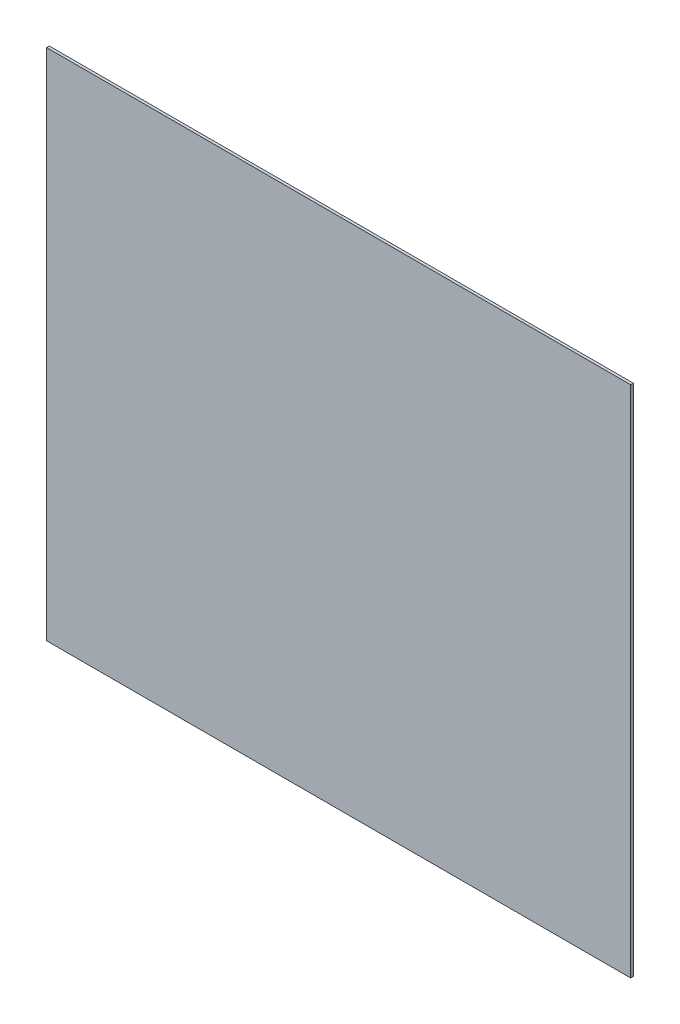
ISO-10303-21;
HEADER;
FILE_DESCRIPTION(('STEP AP214'),'2;1');
FILE_NAME('part.step','',(''),(''),'','','');
FILE_SCHEMA(('AUTOMOTIVE_DESIGN { 1 0 10303 214 1 1 1 1 }'));
ENDSEC;
DATA;
#1=APPLICATION_CONTEXT('core data for automotive mechanical design processes');
#2=APPLICATION_PROTOCOL_DEFINITION('international standard','automotive_design',2000,#1);
#3=PRODUCT_CONTEXT('',#1,'mechanical');
#4=PRODUCT('Part','Part','',(#3));
#5=PRODUCT_RELATED_PRODUCT_CATEGORY('part','',(#4));
#6=PRODUCT_DEFINITION_FORMATION('','',#4);
#7=PRODUCT_DEFINITION_CONTEXT('part definition',#1,'design');
#8=PRODUCT_DEFINITION('design','',#6,#7);
#9=PRODUCT_DEFINITION_SHAPE('','',#8);
#10=(LENGTH_UNIT() NAMED_UNIT(*) SI_UNIT(.MILLI.,.METRE.));
#11=(NAMED_UNIT(*) PLANE_ANGLE_UNIT() SI_UNIT($,.RADIAN.));
#12=(NAMED_UNIT(*) SI_UNIT($,.STERADIAN.) SOLID_ANGLE_UNIT());
#13=UNCERTAINTY_MEASURE_WITH_UNIT(LENGTH_MEASURE(1.E-05),#10,'distance_accuracy_value','');
#14=(GEOMETRIC_REPRESENTATION_CONTEXT(3) GLOBAL_UNCERTAINTY_ASSIGNED_CONTEXT((#13)) GLOBAL_UNIT_ASSIGNED_CONTEXT((#10,
#11,#12)) REPRESENTATION_CONTEXT('',''));
#15=CARTESIAN_POINT('',(0.,0.,0.));
#16=DIRECTION('',(0.,0.,1.));
#17=DIRECTION('',(1.,0.,0.));
#18=AXIS2_PLACEMENT_3D('',#15,#16,#17);
#19=CARTESIAN_POINT('',(-432.,380.,4.));
#20=DIRECTION('',(1.,0.,0.));
#21=DIRECTION('',(0.,1.,0.));
#22=AXIS2_PLACEMENT_3D('',#19,#20,#21);
#23=PLANE('',#22);
#24=DIRECTION('',(0.,-1.,0.));
#25=VECTOR('',#24,1.);
#26=CARTESIAN_POINT('',(-432.,380.,0.));
#27=LINE('',#26,#25);
#28=CARTESIAN_POINT('',(-432.,380.,0.));
#29=VERTEX_POINT('',#28);
#30=CARTESIAN_POINT('',(-432.,-380.,0.));
#31=VERTEX_POINT('',#30);
#32=EDGE_CURVE('E95',#29,#31,#27,.T.);
#33=ORIENTED_EDGE('',*,*,#32,.T.);
#34=DIRECTION('',(0.,0.,-1.));
#35=VECTOR('',#34,1.);
#36=CARTESIAN_POINT('',(-432.,-380.,4.));
#37=LINE('',#36,#35);
#38=CARTESIAN_POINT('',(-432.,-380.,4.));
#39=VERTEX_POINT('',#38);
#40=EDGE_CURVE('E11',#39,#31,#37,.T.);
#41=ORIENTED_EDGE('',*,*,#40,.F.);
#42=DIRECTION('',(0.,-1.,0.));
#43=VECTOR('',#42,1.);
#44=CARTESIAN_POINT('',(-432.,380.,4.));
#45=LINE('',#44,#43);
#46=CARTESIAN_POINT('',(-432.,380.,4.));
#47=VERTEX_POINT('',#46);
#48=EDGE_CURVE('E83',#47,#39,#45,.T.);
#49=ORIENTED_EDGE('',*,*,#48,.F.);
#50=DIRECTION('',(0.,0.,-1.));
#51=VECTOR('',#50,1.);
#52=CARTESIAN_POINT('',(-432.,380.,4.));
#53=LINE('',#52,#51);
#54=EDGE_CURVE('E91',#47,#29,#53,.T.);
#55=ORIENTED_EDGE('',*,*,#54,.T.);
#56=EDGE_LOOP('',(#33,#41,#49,#55));
#57=FACE_BOUND('',#56,.T.);
#58=ADVANCED_FACE('F32',(#57),#23,.F.);
#59=CARTESIAN_POINT('',(-432.,-380.,4.));
#60=DIRECTION('',(0.,1.,0.));
#61=DIRECTION('',(-1.,0.,0.));
#62=AXIS2_PLACEMENT_3D('',#59,#60,#61);
#63=PLANE('',#62);
#64=DIRECTION('',(1.,0.,0.));
#65=VECTOR('',#64,1.);
#66=CARTESIAN_POINT('',(-432.,-380.,0.));
#67=LINE('',#66,#65);
#68=CARTESIAN_POINT('',(432.,-380.,0.));
#69=VERTEX_POINT('',#68);
#70=EDGE_CURVE('E87',#31,#69,#67,.T.);
#71=ORIENTED_EDGE('',*,*,#70,.T.);
#72=DIRECTION('',(0.,0.,-1.));
#73=VECTOR('',#72,1.);
#74=CARTESIAN_POINT('',(432.,-380.,4.));
#75=LINE('',#74,#73);
#76=CARTESIAN_POINT('',(432.,-380.,4.));
#77=VERTEX_POINT('',#76);
#78=EDGE_CURVE('E40',#77,#69,#75,.T.);
#79=ORIENTED_EDGE('',*,*,#78,.F.);
#80=DIRECTION('',(1.,0.,0.));
#81=VECTOR('',#80,1.);
#82=CARTESIAN_POINT('',(-432.,-380.,4.));
#83=LINE('',#82,#81);
#84=EDGE_CURVE('E78',#39,#77,#83,.T.);
#85=ORIENTED_EDGE('',*,*,#84,.F.);
#86=ORIENTED_EDGE('',*,*,#40,.T.);
#87=EDGE_LOOP('',(#71,#79,#85,#86));
#88=FACE_BOUND('',#87,.T.);
#89=ADVANCED_FACE('F86',(#88),#63,.F.);
#90=CARTESIAN_POINT('',(432.,380.,4.));
#91=DIRECTION('',(-1.,0.,0.));
#92=DIRECTION('',(0.,0.,1.));
#93=AXIS2_PLACEMENT_3D('',#90,#91,#92);
#94=PLANE('',#93);
#95=DIRECTION('',(0.,1.,0.));
#96=VECTOR('',#95,1.);
#97=CARTESIAN_POINT('',(432.,380.,0.));
#98=LINE('',#97,#96);
#99=CARTESIAN_POINT('',(432.,380.,0.));
#100=VERTEX_POINT('',#99);
#101=EDGE_CURVE('E65',#69,#100,#98,.T.);
#102=ORIENTED_EDGE('',*,*,#101,.T.);
#103=DIRECTION('',(0.,0.,-1.));
#104=VECTOR('',#103,1.);
#105=CARTESIAN_POINT('',(432.,380.,4.));
#106=LINE('',#105,#104);
#107=CARTESIAN_POINT('',(432.,380.,4.));
#108=VERTEX_POINT('',#107);
#109=EDGE_CURVE('E88',#108,#100,#106,.T.);
#110=ORIENTED_EDGE('',*,*,#109,.F.);
#111=DIRECTION('',(0.,1.,0.));
#112=VECTOR('',#111,1.);
#113=CARTESIAN_POINT('',(432.,380.,4.));
#114=LINE('',#113,#112);
#115=EDGE_CURVE('E81',#77,#108,#114,.T.);
#116=ORIENTED_EDGE('',*,*,#115,.F.);
#117=ORIENTED_EDGE('',*,*,#78,.T.);
#118=EDGE_LOOP('',(#102,#110,#116,#117));
#119=FACE_BOUND('',#118,.T.);
#120=ADVANCED_FACE('F89',(#119),#94,.F.);
#121=CARTESIAN_POINT('',(-432.,380.,4.));
#122=DIRECTION('',(0.,-1.,0.));
#123=DIRECTION('',(1.,0.,0.));
#124=AXIS2_PLACEMENT_3D('',#121,#122,#123);
#125=PLANE('',#124);
#126=DIRECTION('',(-1.,0.,0.));
#127=VECTOR('',#126,1.);
#128=CARTESIAN_POINT('',(-432.,380.,0.));
#129=LINE('',#128,#127);
#130=EDGE_CURVE('E71',#100,#29,#129,.T.);
#131=ORIENTED_EDGE('',*,*,#130,.T.);
#132=ORIENTED_EDGE('',*,*,#54,.F.);
#133=DIRECTION('',(-1.,0.,0.));
#134=VECTOR('',#133,1.);
#135=CARTESIAN_POINT('',(-432.,380.,4.));
#136=LINE('',#135,#134);
#137=EDGE_CURVE('E48',#108,#47,#136,.T.);
#138=ORIENTED_EDGE('',*,*,#137,.F.);
#139=ORIENTED_EDGE('',*,*,#109,.T.);
#140=EDGE_LOOP('',(#131,#132,#138,#139));
#141=FACE_BOUND('',#140,.T.);
#142=ADVANCED_FACE('F102',(#141),#125,.F.);
#143=CARTESIAN_POINT('',(0.,0.,4.));
#144=DIRECTION('',(0.,0.,1.));
#145=DIRECTION('',(1.,0.,0.));
#146=AXIS2_PLACEMENT_3D('',#143,#144,#145);
#147=PLANE('',#146);
#148=ORIENTED_EDGE('',*,*,#48,.T.);
#149=ORIENTED_EDGE('',*,*,#84,.T.);
#150=ORIENTED_EDGE('',*,*,#115,.T.);
#151=ORIENTED_EDGE('',*,*,#137,.T.);
#152=EDGE_LOOP('',(#148,#149,#150,#151));
#153=FACE_BOUND('',#152,.T.);
#154=ADVANCED_FACE('F79',(#153),#147,.T.);
#155=CARTESIAN_POINT('',(0.,0.,0.));
#156=DIRECTION('',(0.,0.,1.));
#157=DIRECTION('',(1.,0.,0.));
#158=AXIS2_PLACEMENT_3D('',#155,#156,#157);
#159=PLANE('',#158);
#160=ORIENTED_EDGE('',*,*,#32,.F.);
#161=ORIENTED_EDGE('',*,*,#130,.F.);
#162=ORIENTED_EDGE('',*,*,#101,.F.);
#163=ORIENTED_EDGE('',*,*,#70,.F.);
#164=EDGE_LOOP('',(#160,#161,#162,#163));
#165=FACE_BOUND('',#164,.T.);
#166=ADVANCED_FACE('F105',(#165),#159,.F.);
#167=CLOSED_SHELL('',(#58,#89,#120,#142,#154,#166));
#168=MANIFOLD_SOLID_BREP('B2',#167);
#169=ADVANCED_BREP_SHAPE_REPRESENTATION('',(#18,#168),#14);
#170=SHAPE_DEFINITION_REPRESENTATION(#9,#169);
ENDSEC;
END-ISO-10303-21;
